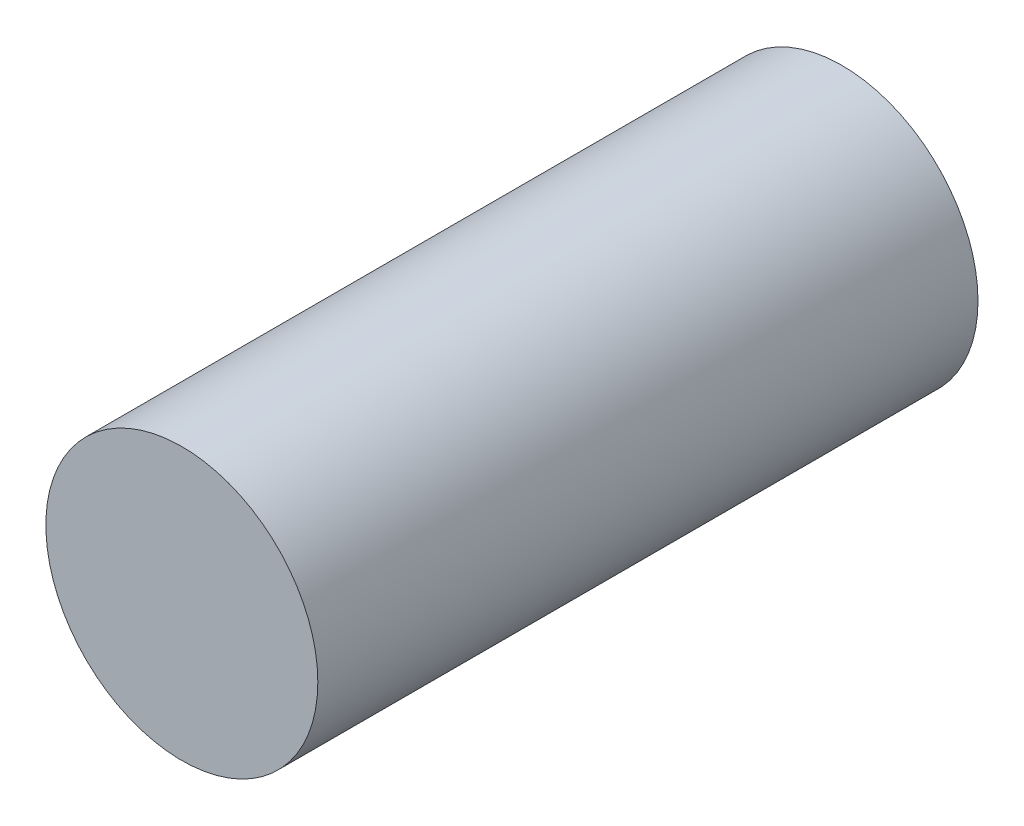
ISO-10303-21;
HEADER;
FILE_DESCRIPTION(('STEP AP214'),'2;1');
FILE_NAME('part.step','',(''),(''),'','','');
FILE_SCHEMA(('AUTOMOTIVE_DESIGN { 1 0 10303 214 1 1 1 1 }'));
ENDSEC;
DATA;
#1=APPLICATION_CONTEXT('core data for automotive mechanical design processes');
#2=APPLICATION_PROTOCOL_DEFINITION('international standard','automotive_design',2000,#1);
#3=PRODUCT_CONTEXT('',#1,'mechanical');
#4=PRODUCT('Part','Part','',(#3));
#5=PRODUCT_RELATED_PRODUCT_CATEGORY('part','',(#4));
#6=PRODUCT_DEFINITION_FORMATION('','',#4);
#7=PRODUCT_DEFINITION_CONTEXT('part definition',#1,'design');
#8=PRODUCT_DEFINITION('design','',#6,#7);
#9=PRODUCT_DEFINITION_SHAPE('','',#8);
#10=(LENGTH_UNIT() NAMED_UNIT(*) SI_UNIT(.MILLI.,.METRE.));
#11=(NAMED_UNIT(*) PLANE_ANGLE_UNIT() SI_UNIT($,.RADIAN.));
#12=(NAMED_UNIT(*) SI_UNIT($,.STERADIAN.) SOLID_ANGLE_UNIT());
#13=UNCERTAINTY_MEASURE_WITH_UNIT(LENGTH_MEASURE(1.E-05),#10,'distance_accuracy_value','');
#14=(GEOMETRIC_REPRESENTATION_CONTEXT(3) GLOBAL_UNCERTAINTY_ASSIGNED_CONTEXT((#13)) GLOBAL_UNIT_ASSIGNED_CONTEXT((#10,
#11,#12)) REPRESENTATION_CONTEXT('',''));
#15=CARTESIAN_POINT('',(0.,0.,0.));
#16=DIRECTION('',(0.,0.,1.));
#17=DIRECTION('',(1.,0.,0.));
#18=AXIS2_PLACEMENT_3D('',#15,#16,#17);
#19=CARTESIAN_POINT('',(0.,0.,10.));
#20=DIRECTION('',(0.,0.,-1.));
#21=DIRECTION('',(-1.,0.,0.));
#22=AXIS2_PLACEMENT_3D('',#19,#20,#21);
#23=CYLINDRICAL_SURFACE('',#22,2.06);
#24=CARTESIAN_POINT('',(0.,0.,10.));
#25=DIRECTION('',(0.,0.,1.));
#26=DIRECTION('',(1.,0.,0.));
#27=AXIS2_PLACEMENT_3D('',#24,#25,#26);
#28=CIRCLE('',#27,2.06);
#29=CARTESIAN_POINT('',(2.06,0.,10.));
#30=VERTEX_POINT('',#29);
#31=EDGE_CURVE('E10',#30,#30,#28,.T.);
#32=ORIENTED_EDGE('',*,*,#31,.F.);
#33=EDGE_LOOP('',(#32));
#34=FACE_BOUND('',#33,.T.);
#35=CARTESIAN_POINT('',(0.,0.,0.));
#36=DIRECTION('',(0.,0.,1.));
#37=DIRECTION('',(1.,0.,0.));
#38=AXIS2_PLACEMENT_3D('',#35,#36,#37);
#39=CIRCLE('',#38,2.06);
#40=CARTESIAN_POINT('',(2.06,0.,0.));
#41=VERTEX_POINT('',#40);
#42=EDGE_CURVE('E40',#41,#41,#39,.T.);
#43=ORIENTED_EDGE('',*,*,#42,.T.);
#44=EDGE_LOOP('',(#43));
#45=FACE_BOUND('',#44,.T.);
#46=ADVANCED_FACE('F37',(#34,#45),#23,.T.);
#47=CARTESIAN_POINT('',(0.,0.,10.));
#48=DIRECTION('',(0.,0.,1.));
#49=DIRECTION('',(1.,0.,0.));
#50=AXIS2_PLACEMENT_3D('',#47,#48,#49);
#51=PLANE('',#50);
#52=ORIENTED_EDGE('',*,*,#31,.T.);
#53=EDGE_LOOP('',(#52));
#54=FACE_BOUND('',#53,.T.);
#55=ADVANCED_FACE('F54',(#54),#51,.T.);
#56=CARTESIAN_POINT('',(0.,0.,0.));
#57=DIRECTION('',(0.,0.,1.));
#58=DIRECTION('',(1.,0.,0.));
#59=AXIS2_PLACEMENT_3D('',#56,#57,#58);
#60=PLANE('',#59);
#61=ORIENTED_EDGE('',*,*,#42,.F.);
#62=EDGE_LOOP('',(#61));
#63=FACE_BOUND('',#62,.T.);
#64=ADVANCED_FACE('F52',(#63),#60,.F.);
#65=CLOSED_SHELL('',(#46,#55,#64));
#66=MANIFOLD_SOLID_BREP('B2',#65);
#67=ADVANCED_BREP_SHAPE_REPRESENTATION('',(#18,#66),#14);
#68=SHAPE_DEFINITION_REPRESENTATION(#9,#67);
ENDSEC;
END-ISO-10303-21;
